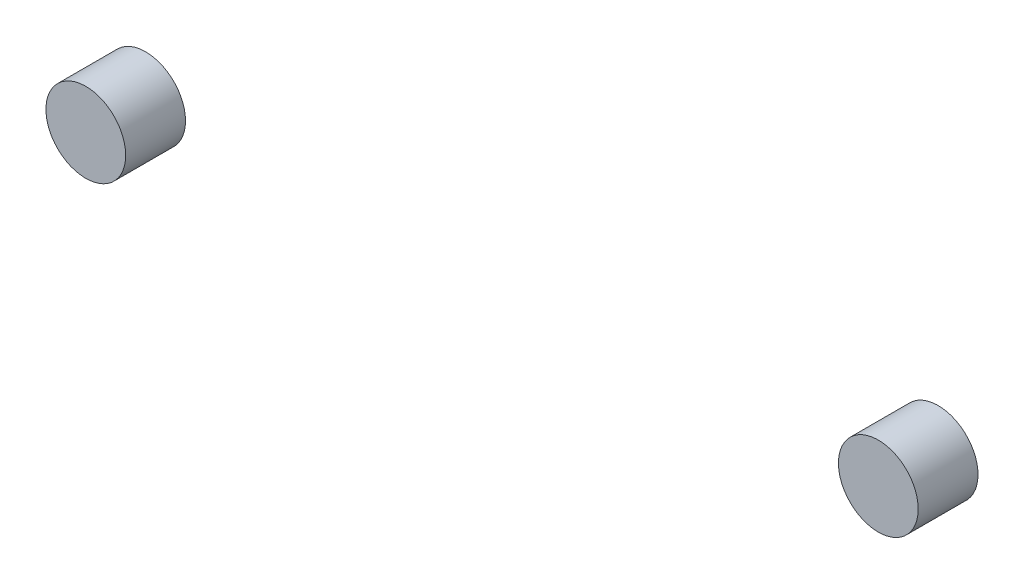
ISO-10303-21;
HEADER;
FILE_DESCRIPTION(('STEP AP214'),'2;1');
FILE_NAME('part.step','',(''),(''),'','','');
FILE_SCHEMA(('AUTOMOTIVE_DESIGN { 1 0 10303 214 1 1 1 1 }'));
ENDSEC;
DATA;
#1=APPLICATION_CONTEXT('core data for automotive mechanical design processes');
#2=APPLICATION_PROTOCOL_DEFINITION('international standard','automotive_design',2000,#1);
#3=PRODUCT_CONTEXT('',#1,'mechanical');
#4=PRODUCT('Part','Part','',(#3));
#5=PRODUCT_RELATED_PRODUCT_CATEGORY('part','',(#4));
#6=PRODUCT_DEFINITION_FORMATION('','',#4);
#7=PRODUCT_DEFINITION_CONTEXT('part definition',#1,'design');
#8=PRODUCT_DEFINITION('design','',#6,#7);
#9=PRODUCT_DEFINITION_SHAPE('','',#8);
#10=(LENGTH_UNIT() NAMED_UNIT(*) SI_UNIT(.MILLI.,.METRE.));
#11=(NAMED_UNIT(*) PLANE_ANGLE_UNIT() SI_UNIT($,.RADIAN.));
#12=(NAMED_UNIT(*) SI_UNIT($,.STERADIAN.) SOLID_ANGLE_UNIT());
#13=UNCERTAINTY_MEASURE_WITH_UNIT(LENGTH_MEASURE(1.E-05),#10,'distance_accuracy_value','');
#14=(GEOMETRIC_REPRESENTATION_CONTEXT(3) GLOBAL_UNCERTAINTY_ASSIGNED_CONTEXT((#13)) GLOBAL_UNIT_ASSIGNED_CONTEXT((#10,
#11,#12)) REPRESENTATION_CONTEXT('',''));
#15=CARTESIAN_POINT('',(0.,0.,0.));
#16=DIRECTION('',(0.,0.,1.));
#17=DIRECTION('',(1.,0.,0.));
#18=AXIS2_PLACEMENT_3D('',#15,#16,#17);
#19=CARTESIAN_POINT('',(19.8724834979268,2.25486133157419,1.5));
#20=DIRECTION('',(0.,0.,-1.));
#21=DIRECTION('',(-1.,0.,0.));
#22=AXIS2_PLACEMENT_3D('',#19,#20,#21);
#23=CYLINDRICAL_SURFACE('',#22,1.);
#24=CARTESIAN_POINT('',(19.8724834979268,2.25486133157419,1.5));
#25=DIRECTION('',(0.,0.,1.));
#26=DIRECTION('',(1.,0.,0.));
#27=AXIS2_PLACEMENT_3D('',#24,#25,#26);
#28=CIRCLE('',#27,1.);
#29=CARTESIAN_POINT('',(20.8724834979268,2.25486133157419,1.5));
#30=VERTEX_POINT('',#29);
#31=EDGE_CURVE('E47',#30,#30,#28,.T.);
#32=ORIENTED_EDGE('',*,*,#31,.F.);
#33=EDGE_LOOP('',(#32));
#34=FACE_BOUND('',#33,.T.);
#35=CARTESIAN_POINT('',(19.8724834979268,2.25486133157419,0.));
#36=DIRECTION('',(0.,0.,1.));
#37=DIRECTION('',(1.,0.,0.));
#38=AXIS2_PLACEMENT_3D('',#35,#36,#37);
#39=CIRCLE('',#38,1.);
#40=CARTESIAN_POINT('',(20.8724834979268,2.25486133157419,0.));
#41=VERTEX_POINT('',#40);
#42=EDGE_CURVE('E11',#41,#41,#39,.T.);
#43=ORIENTED_EDGE('',*,*,#42,.T.);
#44=EDGE_LOOP('',(#43));
#45=FACE_BOUND('',#44,.T.);
#46=ADVANCED_FACE('F43',(#34,#45),#23,.T.);
#47=CARTESIAN_POINT('',(19.8724834979268,2.25486133157419,1.5));
#48=DIRECTION('',(0.,0.,1.));
#49=DIRECTION('',(1.,0.,0.));
#50=AXIS2_PLACEMENT_3D('',#47,#48,#49);
#51=PLANE('',#50);
#52=ORIENTED_EDGE('',*,*,#31,.T.);
#53=EDGE_LOOP('',(#52));
#54=FACE_BOUND('',#53,.T.);
#55=ADVANCED_FACE('F45',(#54),#51,.T.);
#56=CARTESIAN_POINT('',(19.8724834979268,2.25486133157419,0.));
#57=DIRECTION('',(0.,0.,1.));
#58=DIRECTION('',(1.,0.,0.));
#59=AXIS2_PLACEMENT_3D('',#56,#57,#58);
#60=PLANE('',#59);
#61=ORIENTED_EDGE('',*,*,#42,.F.);
#62=EDGE_LOOP('',(#61));
#63=FACE_BOUND('',#62,.T.);
#64=ADVANCED_FACE('F62',(#63),#60,.F.);
#65=CLOSED_SHELL('',(#46,#55,#64));
#66=MANIFOLD_SOLID_BREP('B2',#65);
#67=CARTESIAN_POINT('',(0.,0.,1.5));
#68=DIRECTION('',(0.,0.,-1.));
#69=DIRECTION('',(-1.,0.,0.));
#70=AXIS2_PLACEMENT_3D('',#67,#68,#69);
#71=CYLINDRICAL_SURFACE('',#70,1.);
#72=CARTESIAN_POINT('',(0.,0.,1.5));
#73=DIRECTION('',(0.,0.,1.));
#74=DIRECTION('',(1.,0.,0.));
#75=AXIS2_PLACEMENT_3D('',#72,#73,#74);
#76=CIRCLE('',#75,1.);
#77=CARTESIAN_POINT('',(1.,0.,1.5));
#78=VERTEX_POINT('',#77);
#79=EDGE_CURVE('E42',#78,#78,#76,.T.);
#80=ORIENTED_EDGE('',*,*,#79,.F.);
#81=EDGE_LOOP('',(#80));
#82=FACE_BOUND('',#81,.T.);
#83=CARTESIAN_POINT('',(0.,0.,0.));
#84=DIRECTION('',(0.,0.,1.));
#85=DIRECTION('',(1.,0.,0.));
#86=AXIS2_PLACEMENT_3D('',#83,#84,#85);
#87=CIRCLE('',#86,1.);
#88=CARTESIAN_POINT('',(1.,0.,0.));
#89=VERTEX_POINT('',#88);
#90=EDGE_CURVE('E87',#89,#89,#87,.T.);
#91=ORIENTED_EDGE('',*,*,#90,.T.);
#92=EDGE_LOOP('',(#91));
#93=FACE_BOUND('',#92,.T.);
#94=ADVANCED_FACE('F84',(#82,#93),#71,.T.);
#95=CARTESIAN_POINT('',(0.,0.,1.5));
#96=DIRECTION('',(0.,0.,1.));
#97=DIRECTION('',(1.,0.,0.));
#98=AXIS2_PLACEMENT_3D('',#95,#96,#97);
#99=PLANE('',#98);
#100=ORIENTED_EDGE('',*,*,#79,.T.);
#101=EDGE_LOOP('',(#100));
#102=FACE_BOUND('',#101,.T.);
#103=ADVANCED_FACE('F99',(#102),#99,.T.);
#104=CARTESIAN_POINT('',(0.,0.,0.));
#105=DIRECTION('',(0.,0.,1.));
#106=DIRECTION('',(1.,0.,0.));
#107=AXIS2_PLACEMENT_3D('',#104,#105,#106);
#108=PLANE('',#107);
#109=ORIENTED_EDGE('',*,*,#90,.F.);
#110=EDGE_LOOP('',(#109));
#111=FACE_BOUND('',#110,.T.);
#112=ADVANCED_FACE('F97',(#111),#108,.F.);
#113=CLOSED_SHELL('',(#94,#103,#112));
#114=MANIFOLD_SOLID_BREP('B6',#113);
#115=ADVANCED_BREP_SHAPE_REPRESENTATION('',(#18,#66,#114),#14);
#116=SHAPE_DEFINITION_REPRESENTATION(#9,#115);
ENDSEC;
END-ISO-10303-21;
